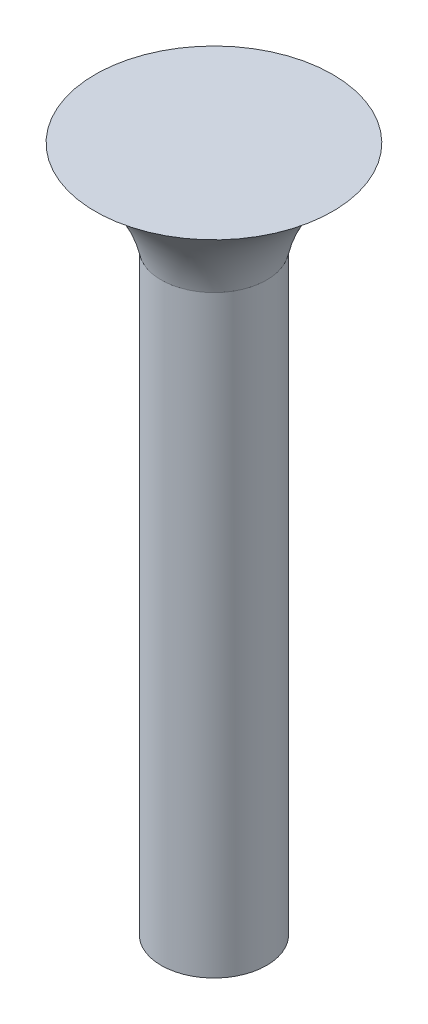
ISO-10303-21;
HEADER;
FILE_DESCRIPTION(('STEP AP214'),'2;1');
FILE_NAME('part.step','',(''),(''),'','','');
FILE_SCHEMA(('AUTOMOTIVE_DESIGN { 1 0 10303 214 1 1 1 1 }'));
ENDSEC;
DATA;
#1=APPLICATION_CONTEXT('core data for automotive mechanical design processes');
#2=APPLICATION_PROTOCOL_DEFINITION('international standard','automotive_design',2000,#1);
#3=PRODUCT_CONTEXT('',#1,'mechanical');
#4=PRODUCT('Part','Part','',(#3));
#5=PRODUCT_RELATED_PRODUCT_CATEGORY('part','',(#4));
#6=PRODUCT_DEFINITION_FORMATION('','',#4);
#7=PRODUCT_DEFINITION_CONTEXT('part definition',#1,'design');
#8=PRODUCT_DEFINITION('design','',#6,#7);
#9=PRODUCT_DEFINITION_SHAPE('','',#8);
#10=(LENGTH_UNIT() NAMED_UNIT(*) SI_UNIT(.MILLI.,.METRE.));
#11=(NAMED_UNIT(*) PLANE_ANGLE_UNIT() SI_UNIT($,.RADIAN.));
#12=(NAMED_UNIT(*) SI_UNIT($,.STERADIAN.) SOLID_ANGLE_UNIT());
#13=UNCERTAINTY_MEASURE_WITH_UNIT(LENGTH_MEASURE(1.E-05),#10,'distance_accuracy_value','');
#14=(GEOMETRIC_REPRESENTATION_CONTEXT(3) GLOBAL_UNCERTAINTY_ASSIGNED_CONTEXT((#13)) GLOBAL_UNIT_ASSIGNED_CONTEXT((#10,
#11,#12)) REPRESENTATION_CONTEXT('',''));
#15=CARTESIAN_POINT('',(0.,0.,0.));
#16=DIRECTION('',(0.,0.,1.));
#17=DIRECTION('',(1.,0.,0.));
#18=AXIS2_PLACEMENT_3D('',#15,#16,#17);
#19=CARTESIAN_POINT('',(0.,132.08,0.));
#20=DIRECTION('',(0.,-1.,0.));
#21=DIRECTION('',(0.,0.,-1.));
#22=AXIS2_PLACEMENT_3D('',#19,#20,#21);
#23=CYLINDRICAL_SURFACE('',#22,10.16);
#24=CARTESIAN_POINT('',(0.,114.3,0.));
#25=DIRECTION('',(0.,-1.,0.));
#26=DIRECTION('',(0.,0.,-1.));
#27=AXIS2_PLACEMENT_3D('',#24,#25,#26);
#28=CIRCLE('',#27,10.16);
#29=CARTESIAN_POINT('',(0.,114.3,-10.16));
#30=VERTEX_POINT('',#29);
#31=EDGE_CURVE('E40',#30,#30,#28,.T.);
#32=ORIENTED_EDGE('',*,*,#31,.T.);
#33=EDGE_LOOP('',(#32));
#34=FACE_BOUND('',#33,.T.);
#35=CARTESIAN_POINT('',(0.,0.,0.));
#36=DIRECTION('',(0.,1.,0.));
#37=DIRECTION('',(0.,0.,1.));
#38=AXIS2_PLACEMENT_3D('',#35,#36,#37);
#39=CIRCLE('',#38,10.16);
#40=CARTESIAN_POINT('',(0.,0.,10.16));
#41=VERTEX_POINT('',#40);
#42=EDGE_CURVE('E10',#41,#41,#39,.T.);
#43=ORIENTED_EDGE('',*,*,#42,.T.);
#44=EDGE_LOOP('',(#43));
#45=FACE_BOUND('',#44,.T.);
#46=ADVANCED_FACE('F34',(#34,#45),#23,.T.);
#47=CARTESIAN_POINT('',(0.,0.,0.));
#48=DIRECTION('',(0.,1.,0.));
#49=DIRECTION('',(0.,0.,1.));
#50=AXIS2_PLACEMENT_3D('',#47,#48,#49);
#51=PLANE('',#50);
#52=ORIENTED_EDGE('',*,*,#42,.F.);
#53=EDGE_LOOP('',(#52));
#54=FACE_BOUND('',#53,.T.);
#55=ADVANCED_FACE('F60',(#54),#51,.F.);
#56=CARTESIAN_POINT('',(0.,108.837410808373,0.));
#57=DIRECTION('',(0.,-1.,0.));
#58=DIRECTION('',(0.,0.,-1.));
#59=AXIS2_PLACEMENT_3D('',#56,#57,#58);
#60=TOROIDAL_SURFACE('',#59,36.6036248682772,27.0019476492093);
#61=CARTESIAN_POINT('',(0.,132.08,0.));
#62=DIRECTION('',(0.,-1.,0.));
#63=DIRECTION('',(0.,0.,-1.));
#64=AXIS2_PLACEMENT_3D('',#61,#62,#63);
#65=CIRCLE('',#64,22.86);
#66=CARTESIAN_POINT('',(0.,132.08,-22.86));
#67=VERTEX_POINT('',#66);
#68=EDGE_CURVE('E44',#67,#67,#65,.T.);
#69=ORIENTED_EDGE('',*,*,#68,.T.);
#70=EDGE_LOOP('',(#69));
#71=FACE_BOUND('',#70,.T.);
#72=ORIENTED_EDGE('',*,*,#31,.F.);
#73=EDGE_LOOP('',(#72));
#74=FACE_BOUND('',#73,.T.);
#75=ADVANCED_FACE('F51',(#71,#74),#60,.F.);
#76=CARTESIAN_POINT('',(0.,132.08,0.));
#77=DIRECTION('',(0.,1.,0.));
#78=DIRECTION('',(0.,0.,1.));
#79=AXIS2_PLACEMENT_3D('',#76,#77,#78);
#80=PLANE('',#79);
#81=ORIENTED_EDGE('',*,*,#68,.F.);
#82=EDGE_LOOP('',(#81));
#83=FACE_BOUND('',#82,.T.);
#84=ADVANCED_FACE('F54',(#83),#80,.T.);
#85=CLOSED_SHELL('',(#46,#55,#75,#84));
#86=MANIFOLD_SOLID_BREP('B2',#85);
#87=ADVANCED_BREP_SHAPE_REPRESENTATION('',(#18,#86),#14);
#88=SHAPE_DEFINITION_REPRESENTATION(#9,#87);
ENDSEC;
END-ISO-10303-21;
